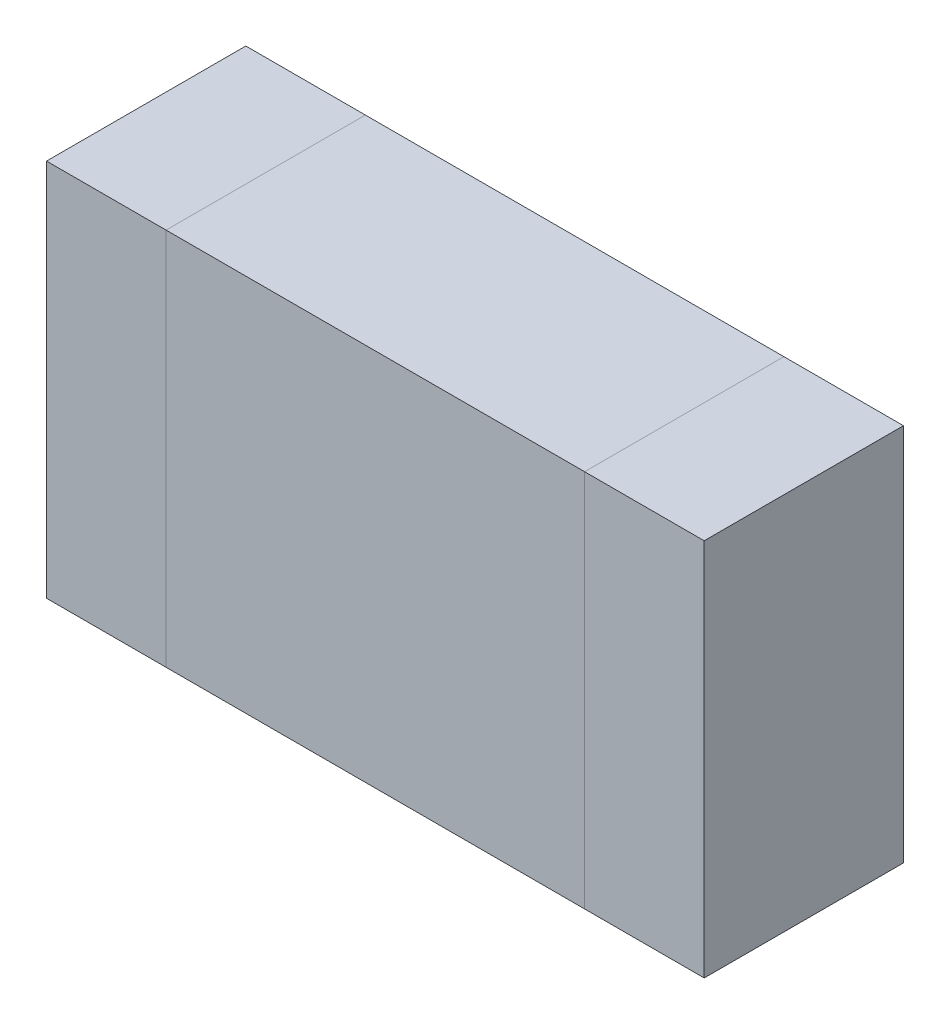
ISO-10303-21;
HEADER;
FILE_DESCRIPTION(('STEP AP214'),'2;1');
FILE_NAME('part.step','',(''),(''),'','','');
FILE_SCHEMA(('AUTOMOTIVE_DESIGN { 1 0 10303 214 1 1 1 1 }'));
ENDSEC;
DATA;
#1=APPLICATION_CONTEXT('core data for automotive mechanical design processes');
#2=APPLICATION_PROTOCOL_DEFINITION('international standard','automotive_design',2000,#1);
#3=PRODUCT_CONTEXT('',#1,'mechanical');
#4=PRODUCT('Part','Part','',(#3));
#5=PRODUCT_RELATED_PRODUCT_CATEGORY('part','',(#4));
#6=PRODUCT_DEFINITION_FORMATION('','',#4);
#7=PRODUCT_DEFINITION_CONTEXT('part definition',#1,'design');
#8=PRODUCT_DEFINITION('design','',#6,#7);
#9=PRODUCT_DEFINITION_SHAPE('','',#8);
#10=(LENGTH_UNIT() NAMED_UNIT(*) SI_UNIT(.MILLI.,.METRE.));
#11=(NAMED_UNIT(*) PLANE_ANGLE_UNIT() SI_UNIT($,.RADIAN.));
#12=(NAMED_UNIT(*) SI_UNIT($,.STERADIAN.) SOLID_ANGLE_UNIT());
#13=UNCERTAINTY_MEASURE_WITH_UNIT(LENGTH_MEASURE(1.E-05),#10,'distance_accuracy_value','');
#14=(GEOMETRIC_REPRESENTATION_CONTEXT(3) GLOBAL_UNCERTAINTY_ASSIGNED_CONTEXT((#13)) GLOBAL_UNIT_ASSIGNED_CONTEXT((#10,
#11,#12)) REPRESENTATION_CONTEXT('',''));
#15=CARTESIAN_POINT('',(0.,0.,0.));
#16=DIRECTION('',(0.,0.,1.));
#17=DIRECTION('',(1.,0.,0.));
#18=AXIS2_PLACEMENT_3D('',#15,#16,#17);
#19=CARTESIAN_POINT('',(0.52500022,0.47500032,0.));
#20=DIRECTION('',(1.,0.,0.));
#21=DIRECTION('',(0.,-1.,0.));
#22=AXIS2_PLACEMENT_3D('',#19,#20,#21);
#23=PLANE('',#22);
#24=DIRECTION('',(0.,0.,1.));
#25=VECTOR('',#24,1.);
#26=CARTESIAN_POINT('',(0.52500022,0.47500032,0.));
#27=LINE('',#26,#25);
#28=CARTESIAN_POINT('',(0.52500022,0.47500032,0.));
#29=VERTEX_POINT('',#28);
#30=CARTESIAN_POINT('',(0.52500022,0.47500032,0.499999));
#31=VERTEX_POINT('',#30);
#32=EDGE_CURVE('P0_E11',#29,#31,#27,.T.);
#33=ORIENTED_EDGE('',*,*,#32,.T.);
#34=DIRECTION('',(0.,-1.,0.));
#35=VECTOR('',#34,1.);
#36=CARTESIAN_POINT('',(0.52500022,0.47500032,0.499999));
#37=LINE('',#36,#35);
#38=CARTESIAN_POINT('',(0.52500022,-0.47500032,0.499999));
#39=VERTEX_POINT('',#38);
#40=EDGE_CURVE('P0_E24',#31,#39,#37,.T.);
#41=ORIENTED_EDGE('',*,*,#40,.T.);
#42=DIRECTION('',(0.,0.,1.));
#43=VECTOR('',#42,1.);
#44=CARTESIAN_POINT('',(0.52500022,-0.47500032,0.));
#45=LINE('',#44,#43);
#46=CARTESIAN_POINT('',(0.52500022,-0.47500032,0.));
#47=VERTEX_POINT('',#46);
#48=EDGE_CURVE('P0_E85',#47,#39,#45,.T.);
#49=ORIENTED_EDGE('',*,*,#48,.F.);
#50=DIRECTION('',(0.,-1.,0.));
#51=VECTOR('',#50,1.);
#52=CARTESIAN_POINT('',(0.52500022,0.47500032,0.));
#53=LINE('',#52,#51);
#54=EDGE_CURVE('P0_E83',#29,#47,#53,.T.);
#55=ORIENTED_EDGE('',*,*,#54,.F.);
#56=EDGE_LOOP('',(#33,#41,#49,#55));
#57=FACE_BOUND('',#56,.T.);
#58=ADVANCED_FACE('P0_F17',(#57),#23,.T.);
#59=CARTESIAN_POINT('',(0.52500022,-0.47500032,0.));
#60=DIRECTION('',(0.,-1.,0.));
#61=DIRECTION('',(-1.,0.,0.));
#62=AXIS2_PLACEMENT_3D('',#59,#60,#61);
#63=PLANE('',#62);
#64=ORIENTED_EDGE('',*,*,#48,.T.);
#65=DIRECTION('',(-1.,0.,0.));
#66=VECTOR('',#65,1.);
#67=CARTESIAN_POINT('',(0.52500022,-0.47500032,0.499999));
#68=LINE('',#67,#66);
#69=CARTESIAN_POINT('',(-0.52500022,-0.47500032,0.499999));
#70=VERTEX_POINT('',#69);
#71=EDGE_CURVE('P0_E81',#39,#70,#68,.T.);
#72=ORIENTED_EDGE('',*,*,#71,.T.);
#73=DIRECTION('',(0.,0.,1.));
#74=VECTOR('',#73,1.);
#75=CARTESIAN_POINT('',(-0.52500022,-0.47500032,0.));
#76=LINE('',#75,#74);
#77=CARTESIAN_POINT('',(-0.52500022,-0.47500032,0.));
#78=VERTEX_POINT('',#77);
#79=EDGE_CURVE('P0_E79',#78,#70,#76,.T.);
#80=ORIENTED_EDGE('',*,*,#79,.F.);
#81=DIRECTION('',(-1.,0.,0.));
#82=VECTOR('',#81,1.);
#83=CARTESIAN_POINT('',(0.52500022,-0.47500032,0.));
#84=LINE('',#83,#82);
#85=EDGE_CURVE('P0_E70',#47,#78,#84,.T.);
#86=ORIENTED_EDGE('',*,*,#85,.F.);
#87=EDGE_LOOP('',(#64,#72,#80,#86));
#88=FACE_BOUND('',#87,.T.);
#89=ADVANCED_FACE('P0_F90',(#88),#63,.T.);
#90=CARTESIAN_POINT('',(-0.52500022,-0.47500032,0.));
#91=DIRECTION('',(-1.,0.,0.));
#92=DIRECTION('',(0.,1.,0.));
#93=AXIS2_PLACEMENT_3D('',#90,#91,#92);
#94=PLANE('',#93);
#95=ORIENTED_EDGE('',*,*,#79,.T.);
#96=DIRECTION('',(0.,1.,0.));
#97=VECTOR('',#96,1.);
#98=CARTESIAN_POINT('',(-0.52500022,-0.47500032,0.499999));
#99=LINE('',#98,#97);
#100=CARTESIAN_POINT('',(-0.52500022,0.47500032,0.499999));
#101=VERTEX_POINT('',#100);
#102=EDGE_CURVE('P0_E60',#70,#101,#99,.T.);
#103=ORIENTED_EDGE('',*,*,#102,.T.);
#104=DIRECTION('',(0.,0.,1.));
#105=VECTOR('',#104,1.);
#106=CARTESIAN_POINT('',(-0.52500022,0.47500032,0.));
#107=LINE('',#106,#105);
#108=CARTESIAN_POINT('',(-0.52500022,0.47500032,0.));
#109=VERTEX_POINT('',#108);
#110=EDGE_CURVE('P0_E54',#109,#101,#107,.T.);
#111=ORIENTED_EDGE('',*,*,#110,.F.);
#112=DIRECTION('',(0.,1.,0.));
#113=VECTOR('',#112,1.);
#114=CARTESIAN_POINT('',(-0.52500022,-0.47500032,0.));
#115=LINE('',#114,#113);
#116=EDGE_CURVE('P0_E58',#78,#109,#115,.T.);
#117=ORIENTED_EDGE('',*,*,#116,.F.);
#118=EDGE_LOOP('',(#95,#103,#111,#117));
#119=FACE_BOUND('',#118,.T.);
#120=ADVANCED_FACE('P0_F57',(#119),#94,.T.);
#121=CARTESIAN_POINT('',(-0.52500022,0.47500032,0.));
#122=DIRECTION('',(0.,1.,0.));
#123=DIRECTION('',(1.,0.,0.));
#124=AXIS2_PLACEMENT_3D('',#121,#122,#123);
#125=PLANE('',#124);
#126=ORIENTED_EDGE('',*,*,#110,.T.);
#127=DIRECTION('',(1.,0.,0.));
#128=VECTOR('',#127,1.);
#129=CARTESIAN_POINT('',(-0.52500022,0.47500032,0.499999));
#130=LINE('',#129,#128);
#131=EDGE_CURVE('P0_E71',#101,#31,#130,.T.);
#132=ORIENTED_EDGE('',*,*,#131,.T.);
#133=ORIENTED_EDGE('',*,*,#32,.F.);
#134=DIRECTION('',(1.,0.,0.));
#135=VECTOR('',#134,1.);
#136=CARTESIAN_POINT('',(-0.52500022,0.47500032,0.));
#137=LINE('',#136,#135);
#138=EDGE_CURVE('P0_E68',#109,#29,#137,.T.);
#139=ORIENTED_EDGE('',*,*,#138,.F.);
#140=EDGE_LOOP('',(#126,#132,#133,#139));
#141=FACE_BOUND('',#140,.T.);
#142=ADVANCED_FACE('P0_F73',(#141),#125,.T.);
#143=CARTESIAN_POINT('',(0.,0.,0.));
#144=DIRECTION('',(0.,0.,-1.));
#145=DIRECTION('',(0.,1.,0.));
#146=AXIS2_PLACEMENT_3D('',#143,#144,#145);
#147=PLANE('',#146);
#148=ORIENTED_EDGE('',*,*,#54,.T.);
#149=ORIENTED_EDGE('',*,*,#85,.T.);
#150=ORIENTED_EDGE('',*,*,#116,.T.);
#151=ORIENTED_EDGE('',*,*,#138,.T.);
#152=EDGE_LOOP('',(#148,#149,#150,#151));
#153=FACE_BOUND('',#152,.T.);
#154=ADVANCED_FACE('P0_F67',(#153),#147,.T.);
#155=CARTESIAN_POINT('',(0.,0.,0.499999));
#156=DIRECTION('',(0.,0.,-1.));
#157=DIRECTION('',(0.,1.,0.));
#158=AXIS2_PLACEMENT_3D('',#155,#156,#157);
#159=PLANE('',#158);
#160=ORIENTED_EDGE('',*,*,#131,.F.);
#161=ORIENTED_EDGE('',*,*,#102,.F.);
#162=ORIENTED_EDGE('',*,*,#71,.F.);
#163=ORIENTED_EDGE('',*,*,#40,.F.);
#164=EDGE_LOOP('',(#160,#161,#162,#163));
#165=FACE_BOUND('',#164,.T.);
#166=ADVANCED_FACE('P0_F91',(#165),#159,.F.);
#167=CLOSED_SHELL('',(#58,#89,#120,#142,#154,#166));
#168=MANIFOLD_SOLID_BREP('P0_B1',#167);
#169=CARTESIAN_POINT('',(-0.52500022,0.47500032,0.));
#170=DIRECTION('',(1.,0.,0.));
#171=DIRECTION('',(0.,-1.,0.));
#172=AXIS2_PLACEMENT_3D('',#169,#170,#171);
#173=PLANE('',#172);
#174=DIRECTION('',(0.,0.,1.));
#175=VECTOR('',#174,1.);
#176=CARTESIAN_POINT('',(-0.52500022,0.47500032,0.));
#177=LINE('',#176,#175);
#178=CARTESIAN_POINT('',(-0.52500022,0.47500032,0.));
#179=VERTEX_POINT('',#178);
#180=CARTESIAN_POINT('',(-0.52500022,0.47500032,0.499999));
#181=VERTEX_POINT('',#180);
#182=EDGE_CURVE('P1_E11',#179,#181,#177,.T.);
#183=ORIENTED_EDGE('',*,*,#182,.T.);
#184=DIRECTION('',(0.,-1.,0.));
#185=VECTOR('',#184,1.);
#186=CARTESIAN_POINT('',(-0.52500022,0.47500032,0.499999));
#187=LINE('',#186,#185);
#188=CARTESIAN_POINT('',(-0.52500022,-0.47500032,0.499999));
#189=VERTEX_POINT('',#188);
#190=EDGE_CURVE('P1_E24',#181,#189,#187,.T.);
#191=ORIENTED_EDGE('',*,*,#190,.T.);
#192=DIRECTION('',(0.,0.,1.));
#193=VECTOR('',#192,1.);
#194=CARTESIAN_POINT('',(-0.52500022,-0.47500032,0.));
#195=LINE('',#194,#193);
#196=CARTESIAN_POINT('',(-0.52500022,-0.47500032,0.));
#197=VERTEX_POINT('',#196);
#198=EDGE_CURVE('P1_E85',#197,#189,#195,.T.);
#199=ORIENTED_EDGE('',*,*,#198,.F.);
#200=DIRECTION('',(0.,-1.,0.));
#201=VECTOR('',#200,1.);
#202=CARTESIAN_POINT('',(-0.52500022,0.47500032,0.));
#203=LINE('',#202,#201);
#204=EDGE_CURVE('P1_E83',#179,#197,#203,.T.);
#205=ORIENTED_EDGE('',*,*,#204,.F.);
#206=EDGE_LOOP('',(#183,#191,#199,#205));
#207=FACE_BOUND('',#206,.T.);
#208=ADVANCED_FACE('P1_F17',(#207),#173,.T.);
#209=CARTESIAN_POINT('',(-0.52500022,-0.47500032,0.));
#210=DIRECTION('',(0.,-1.,0.));
#211=DIRECTION('',(-1.,0.,0.));
#212=AXIS2_PLACEMENT_3D('',#209,#210,#211);
#213=PLANE('',#212);
#214=ORIENTED_EDGE('',*,*,#198,.T.);
#215=DIRECTION('',(-1.,0.,0.));
#216=VECTOR('',#215,1.);
#217=CARTESIAN_POINT('',(-0.52500022,-0.47500032,0.499999));
#218=LINE('',#217,#216);
#219=CARTESIAN_POINT('',(-0.82499962,-0.47500032,0.499999));
#220=VERTEX_POINT('',#219);
#221=EDGE_CURVE('P1_E81',#189,#220,#218,.T.);
#222=ORIENTED_EDGE('',*,*,#221,.T.);
#223=DIRECTION('',(0.,0.,1.));
#224=VECTOR('',#223,1.);
#225=CARTESIAN_POINT('',(-0.82499962,-0.47500032,0.));
#226=LINE('',#225,#224);
#227=CARTESIAN_POINT('',(-0.82499962,-0.47500032,0.));
#228=VERTEX_POINT('',#227);
#229=EDGE_CURVE('P1_E79',#228,#220,#226,.T.);
#230=ORIENTED_EDGE('',*,*,#229,.F.);
#231=DIRECTION('',(-1.,0.,0.));
#232=VECTOR('',#231,1.);
#233=CARTESIAN_POINT('',(-0.52500022,-0.47500032,0.));
#234=LINE('',#233,#232);
#235=EDGE_CURVE('P1_E70',#197,#228,#234,.T.);
#236=ORIENTED_EDGE('',*,*,#235,.F.);
#237=EDGE_LOOP('',(#214,#222,#230,#236));
#238=FACE_BOUND('',#237,.T.);
#239=ADVANCED_FACE('P1_F90',(#238),#213,.T.);
#240=CARTESIAN_POINT('',(-0.82499962,-0.47500032,0.));
#241=DIRECTION('',(-1.,0.,0.));
#242=DIRECTION('',(0.,1.,0.));
#243=AXIS2_PLACEMENT_3D('',#240,#241,#242);
#244=PLANE('',#243);
#245=ORIENTED_EDGE('',*,*,#229,.T.);
#246=DIRECTION('',(0.,1.,0.));
#247=VECTOR('',#246,1.);
#248=CARTESIAN_POINT('',(-0.82499962,-0.47500032,0.499999));
#249=LINE('',#248,#247);
#250=CARTESIAN_POINT('',(-0.82499962,0.47500032,0.499999));
#251=VERTEX_POINT('',#250);
#252=EDGE_CURVE('P1_E60',#220,#251,#249,.T.);
#253=ORIENTED_EDGE('',*,*,#252,.T.);
#254=DIRECTION('',(0.,0.,1.));
#255=VECTOR('',#254,1.);
#256=CARTESIAN_POINT('',(-0.82499962,0.47500032,0.));
#257=LINE('',#256,#255);
#258=CARTESIAN_POINT('',(-0.82499962,0.47500032,0.));
#259=VERTEX_POINT('',#258);
#260=EDGE_CURVE('P1_E54',#259,#251,#257,.T.);
#261=ORIENTED_EDGE('',*,*,#260,.F.);
#262=DIRECTION('',(0.,1.,0.));
#263=VECTOR('',#262,1.);
#264=CARTESIAN_POINT('',(-0.82499962,-0.47500032,0.));
#265=LINE('',#264,#263);
#266=EDGE_CURVE('P1_E58',#228,#259,#265,.T.);
#267=ORIENTED_EDGE('',*,*,#266,.F.);
#268=EDGE_LOOP('',(#245,#253,#261,#267));
#269=FACE_BOUND('',#268,.T.);
#270=ADVANCED_FACE('P1_F57',(#269),#244,.T.);
#271=CARTESIAN_POINT('',(-0.82499962,0.47500032,0.));
#272=DIRECTION('',(0.,1.,0.));
#273=DIRECTION('',(1.,0.,0.));
#274=AXIS2_PLACEMENT_3D('',#271,#272,#273);
#275=PLANE('',#274);
#276=ORIENTED_EDGE('',*,*,#260,.T.);
#277=DIRECTION('',(1.,0.,0.));
#278=VECTOR('',#277,1.);
#279=CARTESIAN_POINT('',(-0.82499962,0.47500032,0.499999));
#280=LINE('',#279,#278);
#281=EDGE_CURVE('P1_E71',#251,#181,#280,.T.);
#282=ORIENTED_EDGE('',*,*,#281,.T.);
#283=ORIENTED_EDGE('',*,*,#182,.F.);
#284=DIRECTION('',(1.,0.,0.));
#285=VECTOR('',#284,1.);
#286=CARTESIAN_POINT('',(-0.82499962,0.47500032,0.));
#287=LINE('',#286,#285);
#288=EDGE_CURVE('P1_E68',#259,#179,#287,.T.);
#289=ORIENTED_EDGE('',*,*,#288,.F.);
#290=EDGE_LOOP('',(#276,#282,#283,#289));
#291=FACE_BOUND('',#290,.T.);
#292=ADVANCED_FACE('P1_F73',(#291),#275,.T.);
#293=CARTESIAN_POINT('',(-0.67499992,0.,0.));
#294=DIRECTION('',(0.,0.,-1.));
#295=DIRECTION('',(0.,1.,0.));
#296=AXIS2_PLACEMENT_3D('',#293,#294,#295);
#297=PLANE('',#296);
#298=ORIENTED_EDGE('',*,*,#204,.T.);
#299=ORIENTED_EDGE('',*,*,#235,.T.);
#300=ORIENTED_EDGE('',*,*,#266,.T.);
#301=ORIENTED_EDGE('',*,*,#288,.T.);
#302=EDGE_LOOP('',(#298,#299,#300,#301));
#303=FACE_BOUND('',#302,.T.);
#304=ADVANCED_FACE('P1_F67',(#303),#297,.T.);
#305=CARTESIAN_POINT('',(-0.67499992,0.,0.499999));
#306=DIRECTION('',(0.,0.,-1.));
#307=DIRECTION('',(0.,1.,0.));
#308=AXIS2_PLACEMENT_3D('',#305,#306,#307);
#309=PLANE('',#308);
#310=ORIENTED_EDGE('',*,*,#281,.F.);
#311=ORIENTED_EDGE('',*,*,#252,.F.);
#312=ORIENTED_EDGE('',*,*,#221,.F.);
#313=ORIENTED_EDGE('',*,*,#190,.F.);
#314=EDGE_LOOP('',(#310,#311,#312,#313));
#315=FACE_BOUND('',#314,.T.);
#316=ADVANCED_FACE('P1_F91',(#315),#309,.F.);
#317=CLOSED_SHELL('',(#208,#239,#270,#292,#304,#316));
#318=MANIFOLD_SOLID_BREP('P1_B1',#317);
#319=CARTESIAN_POINT('',(0.82499962,0.47500032,0.));
#320=DIRECTION('',(1.,0.,0.));
#321=DIRECTION('',(0.,-1.,0.));
#322=AXIS2_PLACEMENT_3D('',#319,#320,#321);
#323=PLANE('',#322);
#324=DIRECTION('',(0.,0.,1.));
#325=VECTOR('',#324,1.);
#326=CARTESIAN_POINT('',(0.82499962,0.47500032,0.));
#327=LINE('',#326,#325);
#328=CARTESIAN_POINT('',(0.82499962,0.47500032,0.));
#329=VERTEX_POINT('',#328);
#330=CARTESIAN_POINT('',(0.82499962,0.47500032,0.499999));
#331=VERTEX_POINT('',#330);
#332=EDGE_CURVE('P2_E10',#329,#331,#327,.T.);
#333=ORIENTED_EDGE('',*,*,#332,.T.);
#334=DIRECTION('',(0.,-1.,0.));
#335=VECTOR('',#334,1.);
#336=CARTESIAN_POINT('',(0.82499962,0.47500032,0.499999));
#337=LINE('',#336,#335);
#338=CARTESIAN_POINT('',(0.82499962,-0.47500032,0.499999));
#339=VERTEX_POINT('',#338);
#340=EDGE_CURVE('P2_E23',#331,#339,#337,.T.);
#341=ORIENTED_EDGE('',*,*,#340,.T.);
#342=DIRECTION('',(0.,0.,1.));
#343=VECTOR('',#342,1.);
#344=CARTESIAN_POINT('',(0.82499962,-0.47500032,0.));
#345=LINE('',#344,#343);
#346=CARTESIAN_POINT('',(0.82499962,-0.47500032,0.));
#347=VERTEX_POINT('',#346);
#348=EDGE_CURVE('P2_E83',#347,#339,#345,.T.);
#349=ORIENTED_EDGE('',*,*,#348,.F.);
#350=DIRECTION('',(0.,-1.,0.));
#351=VECTOR('',#350,1.);
#352=CARTESIAN_POINT('',(0.82499962,0.47500032,0.));
#353=LINE('',#352,#351);
#354=EDGE_CURVE('P2_E81',#329,#347,#353,.T.);
#355=ORIENTED_EDGE('',*,*,#354,.F.);
#356=EDGE_LOOP('',(#333,#341,#349,#355));
#357=FACE_BOUND('',#356,.T.);
#358=ADVANCED_FACE('P2_F16',(#357),#323,.T.);
#359=CARTESIAN_POINT('',(0.82499962,-0.47500032,0.));
#360=DIRECTION('',(0.,-1.,0.));
#361=DIRECTION('',(-1.,0.,0.));
#362=AXIS2_PLACEMENT_3D('',#359,#360,#361);
#363=PLANE('',#362);
#364=ORIENTED_EDGE('',*,*,#348,.T.);
#365=DIRECTION('',(-1.,0.,0.));
#366=VECTOR('',#365,1.);
#367=CARTESIAN_POINT('',(0.82499962,-0.47500032,0.499999));
#368=LINE('',#367,#366);
#369=CARTESIAN_POINT('',(0.52500022,-0.47500032,0.499999));
#370=VERTEX_POINT('',#369);
#371=EDGE_CURVE('P2_E78',#339,#370,#368,.T.);
#372=ORIENTED_EDGE('',*,*,#371,.T.);
#373=DIRECTION('',(0.,0.,1.));
#374=VECTOR('',#373,1.);
#375=CARTESIAN_POINT('',(0.52500022,-0.47500032,0.));
#376=LINE('',#375,#374);
#377=CARTESIAN_POINT('',(0.52500022,-0.47500032,0.));
#378=VERTEX_POINT('',#377);
#379=EDGE_CURVE('P2_E76',#378,#370,#376,.T.);
#380=ORIENTED_EDGE('',*,*,#379,.F.);
#381=DIRECTION('',(-1.,0.,0.));
#382=VECTOR('',#381,1.);
#383=CARTESIAN_POINT('',(0.82499962,-0.47500032,0.));
#384=LINE('',#383,#382);
#385=EDGE_CURVE('P2_E67',#347,#378,#384,.T.);
#386=ORIENTED_EDGE('',*,*,#385,.F.);
#387=EDGE_LOOP('',(#364,#372,#380,#386));
#388=FACE_BOUND('',#387,.T.);
#389=ADVANCED_FACE('P2_F89',(#388),#363,.T.);
#390=CARTESIAN_POINT('',(0.52500022,-0.47500032,0.));
#391=DIRECTION('',(-1.,0.,0.));
#392=DIRECTION('',(0.,1.,0.));
#393=AXIS2_PLACEMENT_3D('',#390,#391,#392);
#394=PLANE('',#393);
#395=ORIENTED_EDGE('',*,*,#379,.T.);
#396=DIRECTION('',(0.,1.,0.));
#397=VECTOR('',#396,1.);
#398=CARTESIAN_POINT('',(0.52500022,-0.47500032,0.499999));
#399=LINE('',#398,#397);
#400=CARTESIAN_POINT('',(0.52500022,0.47500032,0.499999));
#401=VERTEX_POINT('',#400);
#402=EDGE_CURVE('P2_E59',#370,#401,#399,.T.);
#403=ORIENTED_EDGE('',*,*,#402,.T.);
#404=DIRECTION('',(0.,0.,1.));
#405=VECTOR('',#404,1.);
#406=CARTESIAN_POINT('',(0.52500022,0.47500032,0.));
#407=LINE('',#406,#405);
#408=CARTESIAN_POINT('',(0.52500022,0.47500032,0.));
#409=VERTEX_POINT('',#408);
#410=EDGE_CURVE('P2_E53',#409,#401,#407,.T.);
#411=ORIENTED_EDGE('',*,*,#410,.F.);
#412=DIRECTION('',(0.,1.,0.));
#413=VECTOR('',#412,1.);
#414=CARTESIAN_POINT('',(0.52500022,-0.47500032,0.));
#415=LINE('',#414,#413);
#416=EDGE_CURVE('P2_E57',#378,#409,#415,.T.);
#417=ORIENTED_EDGE('',*,*,#416,.F.);
#418=EDGE_LOOP('',(#395,#403,#411,#417));
#419=FACE_BOUND('',#418,.T.);
#420=ADVANCED_FACE('P2_F56',(#419),#394,.T.);
#421=CARTESIAN_POINT('',(0.52500022,0.47500032,0.));
#422=DIRECTION('',(0.,1.,0.));
#423=DIRECTION('',(1.,0.,0.));
#424=AXIS2_PLACEMENT_3D('',#421,#422,#423);
#425=PLANE('',#424);
#426=ORIENTED_EDGE('',*,*,#410,.T.);
#427=DIRECTION('',(1.,0.,0.));
#428=VECTOR('',#427,1.);
#429=CARTESIAN_POINT('',(0.52500022,0.47500032,0.499999));
#430=LINE('',#429,#428);
#431=EDGE_CURVE('P2_E68',#401,#331,#430,.T.);
#432=ORIENTED_EDGE('',*,*,#431,.T.);
#433=ORIENTED_EDGE('',*,*,#332,.F.);
#434=DIRECTION('',(1.,0.,0.));
#435=VECTOR('',#434,1.);
#436=CARTESIAN_POINT('',(0.52500022,0.47500032,0.));
#437=LINE('',#436,#435);
#438=EDGE_CURVE('P2_E66',#409,#329,#437,.T.);
#439=ORIENTED_EDGE('',*,*,#438,.F.);
#440=EDGE_LOOP('',(#426,#432,#433,#439));
#441=FACE_BOUND('',#440,.T.);
#442=ADVANCED_FACE('P2_F70',(#441),#425,.T.);
#443=CARTESIAN_POINT('',(0.67499992,0.,0.));
#444=DIRECTION('',(0.,0.,-1.));
#445=DIRECTION('',(0.,1.,0.));
#446=AXIS2_PLACEMENT_3D('',#443,#444,#445);
#447=PLANE('',#446);
#448=ORIENTED_EDGE('',*,*,#354,.T.);
#449=ORIENTED_EDGE('',*,*,#385,.T.);
#450=ORIENTED_EDGE('',*,*,#416,.T.);
#451=ORIENTED_EDGE('',*,*,#438,.T.);
#452=EDGE_LOOP('',(#448,#449,#450,#451));
#453=FACE_BOUND('',#452,.T.);
#454=ADVANCED_FACE('P2_F65',(#453),#447,.T.);
#455=CARTESIAN_POINT('',(0.67499992,0.,0.499999));
#456=DIRECTION('',(0.,0.,-1.));
#457=DIRECTION('',(0.,1.,0.));
#458=AXIS2_PLACEMENT_3D('',#455,#456,#457);
#459=PLANE('',#458);
#460=ORIENTED_EDGE('',*,*,#431,.F.);
#461=ORIENTED_EDGE('',*,*,#402,.F.);
#462=ORIENTED_EDGE('',*,*,#371,.F.);
#463=ORIENTED_EDGE('',*,*,#340,.F.);
#464=EDGE_LOOP('',(#460,#461,#462,#463));
#465=FACE_BOUND('',#464,.T.);
#466=ADVANCED_FACE('P2_F90',(#465),#459,.F.);
#467=CLOSED_SHELL('',(#358,#389,#420,#442,#454,#466));
#468=MANIFOLD_SOLID_BREP('P2_B1',#467);
#469=ADVANCED_BREP_SHAPE_REPRESENTATION('',(#18,#168,#318,#468),#14);
#470=SHAPE_DEFINITION_REPRESENTATION(#9,#469);
ENDSEC;
END-ISO-10303-21;
